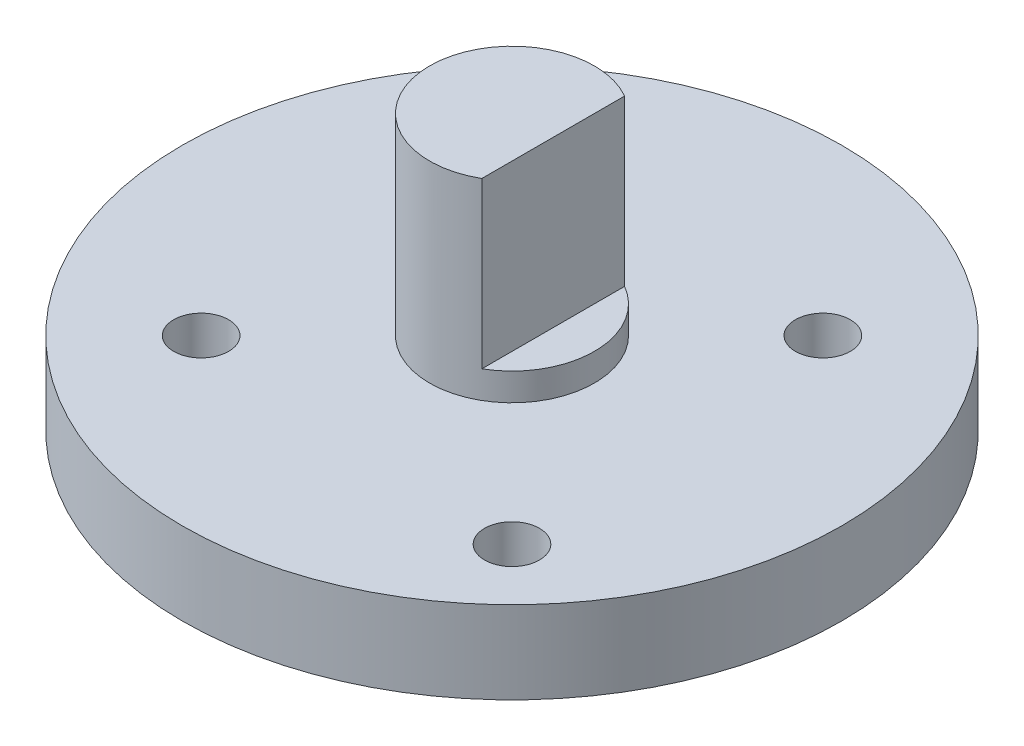
ISO-10303-21;
HEADER;
FILE_DESCRIPTION(('STEP AP214'),'2;1');
FILE_NAME('part.step','',(''),(''),'','','');
FILE_SCHEMA(('AUTOMOTIVE_DESIGN { 1 0 10303 214 1 1 1 1 }'));
ENDSEC;
DATA;
#1=APPLICATION_CONTEXT('core data for automotive mechanical design processes');
#2=APPLICATION_PROTOCOL_DEFINITION('international standard','automotive_design',2000,#1);
#3=PRODUCT_CONTEXT('',#1,'mechanical');
#4=PRODUCT('Part','Part','',(#3));
#5=PRODUCT_RELATED_PRODUCT_CATEGORY('part','',(#4));
#6=PRODUCT_DEFINITION_FORMATION('','',#4);
#7=PRODUCT_DEFINITION_CONTEXT('part definition',#1,'design');
#8=PRODUCT_DEFINITION('design','',#6,#7);
#9=PRODUCT_DEFINITION_SHAPE('','',#8);
#10=(LENGTH_UNIT() NAMED_UNIT(*) SI_UNIT(.MILLI.,.METRE.));
#11=(NAMED_UNIT(*) PLANE_ANGLE_UNIT() SI_UNIT($,.RADIAN.));
#12=(NAMED_UNIT(*) SI_UNIT($,.STERADIAN.) SOLID_ANGLE_UNIT());
#13=UNCERTAINTY_MEASURE_WITH_UNIT(LENGTH_MEASURE(1.E-05),#10,'distance_accuracy_value','');
#14=(GEOMETRIC_REPRESENTATION_CONTEXT(3) GLOBAL_UNCERTAINTY_ASSIGNED_CONTEXT((#13)) GLOBAL_UNIT_ASSIGNED_CONTEXT((#10,
#11,#12)) REPRESENTATION_CONTEXT('',''));
#15=CARTESIAN_POINT('',(0.,0.,0.));
#16=DIRECTION('',(0.,0.,1.));
#17=DIRECTION('',(1.,0.,0.));
#18=AXIS2_PLACEMENT_3D('',#15,#16,#17);
#19=CARTESIAN_POINT('',(-6.5760930650349,3.,-6.57609306503488));
#20=DIRECTION('',(0.,-1.,0.));
#21=DIRECTION('',(0.,0.,-1.));
#22=AXIS2_PLACEMENT_3D('',#19,#20,#21);
#23=CYLINDRICAL_SURFACE('',#22,0.999999999999998);
#24=CARTESIAN_POINT('',(-6.5760930650349,3.,-6.57609306503488));
#25=DIRECTION('',(0.,1.,0.));
#26=DIRECTION('',(0.,0.,1.));
#27=AXIS2_PLACEMENT_3D('',#24,#25,#26);
#28=CIRCLE('',#27,0.999999999999998);
#29=CARTESIAN_POINT('',(-6.5760930650349,3.,-5.57609306503488));
#30=VERTEX_POINT('',#29);
#31=EDGE_CURVE('E116',#30,#30,#28,.T.);
#32=ORIENTED_EDGE('',*,*,#31,.T.);
#33=EDGE_LOOP('',(#32));
#34=FACE_BOUND('',#33,.T.);
#35=CARTESIAN_POINT('',(-6.5760930650349,0.,-6.57609306503488));
#36=DIRECTION('',(0.,1.,0.));
#37=DIRECTION('',(0.,0.,1.));
#38=AXIS2_PLACEMENT_3D('',#35,#36,#37);
#39=CIRCLE('',#38,0.999999999999998);
#40=CARTESIAN_POINT('',(-6.5760930650349,0.,-5.57609306503488));
#41=VERTEX_POINT('',#40);
#42=EDGE_CURVE('E126',#41,#41,#39,.T.);
#43=ORIENTED_EDGE('',*,*,#42,.F.);
#44=EDGE_LOOP('',(#43));
#45=FACE_BOUND('',#44,.T.);
#46=ADVANCED_FACE('F50',(#34,#45),#23,.F.);
#47=CARTESIAN_POINT('',(6.57609306503491,3.,6.57609306503488));
#48=DIRECTION('',(0.,-1.,0.));
#49=DIRECTION('',(0.,0.,-1.));
#50=AXIS2_PLACEMENT_3D('',#47,#48,#49);
#51=CYLINDRICAL_SURFACE('',#50,1.);
#52=CARTESIAN_POINT('',(6.57609306503491,3.,6.57609306503488));
#53=DIRECTION('',(0.,1.,0.));
#54=DIRECTION('',(0.,0.,1.));
#55=AXIS2_PLACEMENT_3D('',#52,#53,#54);
#56=CIRCLE('',#55,1.);
#57=CARTESIAN_POINT('',(6.57609306503491,3.,7.57609306503488));
#58=VERTEX_POINT('',#57);
#59=EDGE_CURVE('E115',#58,#58,#56,.T.);
#60=ORIENTED_EDGE('',*,*,#59,.T.);
#61=EDGE_LOOP('',(#60));
#62=FACE_BOUND('',#61,.T.);
#63=CARTESIAN_POINT('',(6.57609306503491,0.,6.57609306503488));
#64=DIRECTION('',(0.,1.,0.));
#65=DIRECTION('',(0.,0.,1.));
#66=AXIS2_PLACEMENT_3D('',#63,#64,#65);
#67=CIRCLE('',#66,1.);
#68=CARTESIAN_POINT('',(6.57609306503491,0.,7.57609306503488));
#69=VERTEX_POINT('',#68);
#70=EDGE_CURVE('E127',#69,#69,#67,.T.);
#71=ORIENTED_EDGE('',*,*,#70,.F.);
#72=EDGE_LOOP('',(#71));
#73=FACE_BOUND('',#72,.T.);
#74=ADVANCED_FACE('F159',(#62,#73),#51,.F.);
#75=CARTESIAN_POINT('',(5.65685424949237,3.,-5.65685424949239));
#76=DIRECTION('',(0.,-1.,0.));
#77=DIRECTION('',(0.,0.,-1.));
#78=AXIS2_PLACEMENT_3D('',#75,#76,#77);
#79=CYLINDRICAL_SURFACE('',#78,1.);
#80=CARTESIAN_POINT('',(5.65685424949237,3.,-5.65685424949239));
#81=DIRECTION('',(0.,1.,0.));
#82=DIRECTION('',(0.,0.,1.));
#83=AXIS2_PLACEMENT_3D('',#80,#81,#82);
#84=CIRCLE('',#83,1.);
#85=CARTESIAN_POINT('',(5.65685424949237,3.,-4.65685424949239));
#86=VERTEX_POINT('',#85);
#87=EDGE_CURVE('E108',#86,#86,#84,.T.);
#88=ORIENTED_EDGE('',*,*,#87,.T.);
#89=EDGE_LOOP('',(#88));
#90=FACE_BOUND('',#89,.T.);
#91=CARTESIAN_POINT('',(5.65685424949237,0.,-5.65685424949239));
#92=DIRECTION('',(0.,1.,0.));
#93=DIRECTION('',(0.,0.,1.));
#94=AXIS2_PLACEMENT_3D('',#91,#92,#93);
#95=CIRCLE('',#94,1.);
#96=CARTESIAN_POINT('',(5.65685424949237,0.,-4.65685424949239));
#97=VERTEX_POINT('',#96);
#98=EDGE_CURVE('E99',#97,#97,#95,.T.);
#99=ORIENTED_EDGE('',*,*,#98,.F.);
#100=EDGE_LOOP('',(#99));
#101=FACE_BOUND('',#100,.T.);
#102=ADVANCED_FACE('F162',(#90,#101),#79,.F.);
#103=CARTESIAN_POINT('',(-5.65685424949237,3.,5.65685424949239));
#104=DIRECTION('',(0.,-1.,0.));
#105=DIRECTION('',(0.,0.,-1.));
#106=AXIS2_PLACEMENT_3D('',#103,#104,#105);
#107=CYLINDRICAL_SURFACE('',#106,1.);
#108=CARTESIAN_POINT('',(-5.65685424949237,3.,5.65685424949239));
#109=DIRECTION('',(0.,1.,0.));
#110=DIRECTION('',(0.,0.,1.));
#111=AXIS2_PLACEMENT_3D('',#108,#109,#110);
#112=CIRCLE('',#111,1.);
#113=CARTESIAN_POINT('',(-5.65685424949237,3.,6.65685424949239));
#114=VERTEX_POINT('',#113);
#115=EDGE_CURVE('E104',#114,#114,#112,.T.);
#116=ORIENTED_EDGE('',*,*,#115,.T.);
#117=EDGE_LOOP('',(#116));
#118=FACE_BOUND('',#117,.T.);
#119=CARTESIAN_POINT('',(-5.65685424949237,0.,5.65685424949239));
#120=DIRECTION('',(0.,1.,0.));
#121=DIRECTION('',(0.,0.,1.));
#122=AXIS2_PLACEMENT_3D('',#119,#120,#121);
#123=CIRCLE('',#122,1.);
#124=CARTESIAN_POINT('',(-5.65685424949237,0.,6.65685424949239));
#125=VERTEX_POINT('',#124);
#126=EDGE_CURVE('E92',#125,#125,#123,.T.);
#127=ORIENTED_EDGE('',*,*,#126,.F.);
#128=EDGE_LOOP('',(#127));
#129=FACE_BOUND('',#128,.T.);
#130=ADVANCED_FACE('F47',(#118,#129),#107,.F.);
#131=CARTESIAN_POINT('',(0.,3.,0.));
#132=DIRECTION('',(0.,-1.,0.));
#133=DIRECTION('',(0.,0.,-1.));
#134=AXIS2_PLACEMENT_3D('',#131,#132,#133);
#135=CYLINDRICAL_SURFACE('',#134,12.);
#136=CARTESIAN_POINT('',(0.,3.,0.));
#137=DIRECTION('',(0.,1.,0.));
#138=DIRECTION('',(0.,0.,1.));
#139=AXIS2_PLACEMENT_3D('',#136,#137,#138);
#140=CIRCLE('',#139,12.);
#141=CARTESIAN_POINT('',(0.,3.,12.));
#142=VERTEX_POINT('',#141);
#143=EDGE_CURVE('E60',#142,#142,#140,.T.);
#144=ORIENTED_EDGE('',*,*,#143,.F.);
#145=EDGE_LOOP('',(#144));
#146=FACE_BOUND('',#145,.T.);
#147=CARTESIAN_POINT('',(0.,0.,0.));
#148=DIRECTION('',(0.,1.,0.));
#149=DIRECTION('',(0.,0.,1.));
#150=AXIS2_PLACEMENT_3D('',#147,#148,#149);
#151=CIRCLE('',#150,12.);
#152=CARTESIAN_POINT('',(0.,0.,12.));
#153=VERTEX_POINT('',#152);
#154=EDGE_CURVE('E51',#153,#153,#151,.T.);
#155=ORIENTED_EDGE('',*,*,#154,.T.);
#156=EDGE_LOOP('',(#155));
#157=FACE_BOUND('',#156,.T.);
#158=ADVANCED_FACE('F140',(#146,#157),#135,.T.);
#159=CARTESIAN_POINT('',(0.,3.,0.));
#160=DIRECTION('',(0.,1.,0.));
#161=DIRECTION('',(0.,0.,1.));
#162=AXIS2_PLACEMENT_3D('',#159,#160,#161);
#163=PLANE('',#162);
#164=CARTESIAN_POINT('',(0.,3.,0.));
#165=DIRECTION('',(0.,1.,0.));
#166=DIRECTION('',(0.,0.,1.));
#167=AXIS2_PLACEMENT_3D('',#164,#165,#166);
#168=CIRCLE('',#167,3.);
#169=CARTESIAN_POINT('',(0.,3.,3.));
#170=VERTEX_POINT('',#169);
#171=EDGE_CURVE('E11',#170,#170,#168,.T.);
#172=ORIENTED_EDGE('',*,*,#171,.F.);
#173=EDGE_LOOP('',(#172));
#174=FACE_BOUND('',#173,.T.);
#175=ORIENTED_EDGE('',*,*,#115,.F.);
#176=EDGE_LOOP('',(#175));
#177=FACE_BOUND('',#176,.T.);
#178=ORIENTED_EDGE('',*,*,#87,.F.);
#179=EDGE_LOOP('',(#178));
#180=FACE_BOUND('',#179,.T.);
#181=ORIENTED_EDGE('',*,*,#59,.F.);
#182=EDGE_LOOP('',(#181));
#183=FACE_BOUND('',#182,.T.);
#184=ORIENTED_EDGE('',*,*,#31,.F.);
#185=EDGE_LOOP('',(#184));
#186=FACE_BOUND('',#185,.T.);
#187=ORIENTED_EDGE('',*,*,#143,.T.);
#188=EDGE_LOOP('',(#187));
#189=FACE_BOUND('',#188,.T.);
#190=ADVANCED_FACE('F145',(#174,#177,#180,#183,#186,#189),#163,.T.);
#191=CARTESIAN_POINT('',(0.,0.,0.));
#192=DIRECTION('',(0.,1.,0.));
#193=DIRECTION('',(0.,0.,1.));
#194=AXIS2_PLACEMENT_3D('',#191,#192,#193);
#195=PLANE('',#194);
#196=ORIENTED_EDGE('',*,*,#126,.T.);
#197=EDGE_LOOP('',(#196));
#198=FACE_BOUND('',#197,.T.);
#199=ORIENTED_EDGE('',*,*,#98,.T.);
#200=EDGE_LOOP('',(#199));
#201=FACE_BOUND('',#200,.T.);
#202=ORIENTED_EDGE('',*,*,#70,.T.);
#203=EDGE_LOOP('',(#202));
#204=FACE_BOUND('',#203,.T.);
#205=ORIENTED_EDGE('',*,*,#42,.T.);
#206=EDGE_LOOP('',(#205));
#207=FACE_BOUND('',#206,.T.);
#208=ORIENTED_EDGE('',*,*,#154,.F.);
#209=EDGE_LOOP('',(#208));
#210=FACE_BOUND('',#209,.T.);
#211=ADVANCED_FACE('F137',(#198,#201,#204,#207,#210),#195,.F.);
#212=CARTESIAN_POINT('',(0.,10.,0.));
#213=DIRECTION('',(0.,-1.,0.));
#214=DIRECTION('',(0.,0.,-1.));
#215=AXIS2_PLACEMENT_3D('',#212,#213,#214);
#216=CYLINDRICAL_SURFACE('',#215,3.);
#217=CARTESIAN_POINT('',(0.,4.,0.));
#218=DIRECTION('',(0.,1.,0.));
#219=DIRECTION('',(0.,0.,1.));
#220=AXIS2_PLACEMENT_3D('',#217,#218,#219);
#221=CIRCLE('',#220,3.);
#222=CARTESIAN_POINT('',(1.5,4.,2.59807621135332));
#223=VERTEX_POINT('',#222);
#224=CARTESIAN_POINT('',(1.5,4.,-2.59807621135332));
#225=VERTEX_POINT('',#224);
#226=EDGE_CURVE('E66',#223,#225,#221,.T.);
#227=ORIENTED_EDGE('',*,*,#226,.F.);
#228=DIRECTION('',(0.,1.,0.));
#229=VECTOR('',#228,1.);
#230=CARTESIAN_POINT('',(1.5,4.,2.59807621135332));
#231=LINE('',#230,#229);
#232=CARTESIAN_POINT('',(1.5,10.,2.59807621135332));
#233=VERTEX_POINT('',#232);
#234=EDGE_CURVE('E81',#223,#233,#231,.T.);
#235=ORIENTED_EDGE('',*,*,#234,.T.);
#236=CARTESIAN_POINT('',(0.,10.,0.));
#237=DIRECTION('',(0.,1.,0.));
#238=DIRECTION('',(0.,0.,1.));
#239=AXIS2_PLACEMENT_3D('',#236,#237,#238);
#240=CIRCLE('',#239,3.);
#241=CARTESIAN_POINT('',(1.5,10.,-2.59807621135332));
#242=VERTEX_POINT('',#241);
#243=EDGE_CURVE('E86',#242,#233,#240,.T.);
#244=ORIENTED_EDGE('',*,*,#243,.F.);
#245=DIRECTION('',(0.,1.,0.));
#246=VECTOR('',#245,1.);
#247=CARTESIAN_POINT('',(1.5,4.,-2.59807621135332));
#248=LINE('',#247,#246);
#249=EDGE_CURVE('E77',#225,#242,#248,.T.);
#250=ORIENTED_EDGE('',*,*,#249,.F.);
#251=EDGE_LOOP('',(#227,#235,#244,#250));
#252=FACE_BOUND('',#251,.T.);
#253=ORIENTED_EDGE('',*,*,#171,.T.);
#254=EDGE_LOOP('',(#253));
#255=FACE_BOUND('',#254,.T.);
#256=ADVANCED_FACE('F91',(#252,#255),#216,.T.);
#257=CARTESIAN_POINT('',(0.,10.,0.));
#258=DIRECTION('',(0.,1.,0.));
#259=DIRECTION('',(0.,0.,1.));
#260=AXIS2_PLACEMENT_3D('',#257,#258,#259);
#261=PLANE('',#260);
#262=DIRECTION('',(0.,0.,1.));
#263=VECTOR('',#262,1.);
#264=CARTESIAN_POINT('',(1.5,10.,-2.59807621135332));
#265=LINE('',#264,#263);
#266=EDGE_CURVE('E79',#242,#233,#265,.T.);
#267=ORIENTED_EDGE('',*,*,#266,.F.);
#268=ORIENTED_EDGE('',*,*,#243,.T.);
#269=EDGE_LOOP('',(#267,#268));
#270=FACE_BOUND('',#269,.T.);
#271=ADVANCED_FACE('F89',(#270),#261,.T.);
#272=CARTESIAN_POINT('',(1.5,4.,-2.59807621135332));
#273=DIRECTION('',(-1.,0.,0.));
#274=DIRECTION('',(0.,0.,1.));
#275=AXIS2_PLACEMENT_3D('',#272,#273,#274);
#276=PLANE('',#275);
#277=ORIENTED_EDGE('',*,*,#266,.T.);
#278=ORIENTED_EDGE('',*,*,#234,.F.);
#279=DIRECTION('',(0.,0.,1.));
#280=VECTOR('',#279,1.);
#281=CARTESIAN_POINT('',(1.5,4.,-2.59807621135332));
#282=LINE('',#281,#280);
#283=EDGE_CURVE('E61',#225,#223,#282,.T.);
#284=ORIENTED_EDGE('',*,*,#283,.F.);
#285=ORIENTED_EDGE('',*,*,#249,.T.);
#286=EDGE_LOOP('',(#277,#278,#284,#285));
#287=FACE_BOUND('',#286,.T.);
#288=ADVANCED_FACE('F76',(#287),#276,.F.);
#289=CARTESIAN_POINT('',(0.,4.,0.));
#290=DIRECTION('',(0.,1.,0.));
#291=DIRECTION('',(0.,0.,1.));
#292=AXIS2_PLACEMENT_3D('',#289,#290,#291);
#293=PLANE('',#292);
#294=ORIENTED_EDGE('',*,*,#226,.T.);
#295=ORIENTED_EDGE('',*,*,#283,.T.);
#296=EDGE_LOOP('',(#294,#295));
#297=FACE_BOUND('',#296,.T.);
#298=ADVANCED_FACE('F239',(#297),#293,.T.);
#299=CLOSED_SHELL('',(#46,#74,#102,#130,#158,#190,#211,#256,#271,#288,#298));
#300=MANIFOLD_SOLID_BREP('B2',#299);
#301=ADVANCED_BREP_SHAPE_REPRESENTATION('',(#18,#300),#14);
#302=SHAPE_DEFINITION_REPRESENTATION(#9,#301);
ENDSEC;
END-ISO-10303-21;
